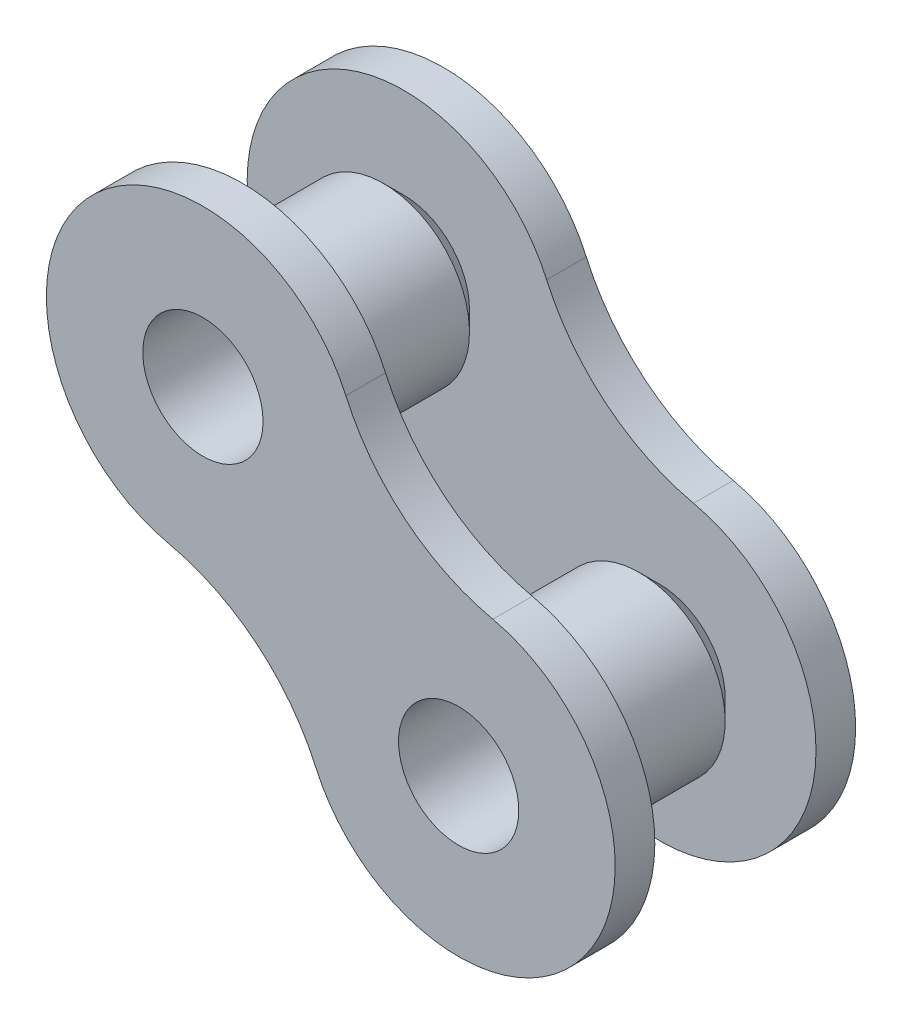
ISO-10303-21;
HEADER;
FILE_DESCRIPTION(('STEP AP214'),'2;1');
FILE_NAME('part.step','',(''),(''),'','','');
FILE_SCHEMA(('AUTOMOTIVE_DESIGN { 1 0 10303 214 1 1 1 1 }'));
ENDSEC;
DATA;
#1=APPLICATION_CONTEXT('core data for automotive mechanical design processes');
#2=APPLICATION_PROTOCOL_DEFINITION('international standard','automotive_design',2000,#1);
#3=PRODUCT_CONTEXT('',#1,'mechanical');
#4=PRODUCT('Part','Part','',(#3));
#5=PRODUCT_RELATED_PRODUCT_CATEGORY('part','',(#4));
#6=PRODUCT_DEFINITION_FORMATION('','',#4);
#7=PRODUCT_DEFINITION_CONTEXT('part definition',#1,'design');
#8=PRODUCT_DEFINITION('design','',#6,#7);
#9=PRODUCT_DEFINITION_SHAPE('','',#8);
#10=(LENGTH_UNIT() NAMED_UNIT(*) SI_UNIT(.MILLI.,.METRE.));
#11=(NAMED_UNIT(*) PLANE_ANGLE_UNIT() SI_UNIT($,.RADIAN.));
#12=(NAMED_UNIT(*) SI_UNIT($,.STERADIAN.) SOLID_ANGLE_UNIT());
#13=UNCERTAINTY_MEASURE_WITH_UNIT(LENGTH_MEASURE(1.E-05),#10,'distance_accuracy_value','');
#14=(GEOMETRIC_REPRESENTATION_CONTEXT(3) GLOBAL_UNCERTAINTY_ASSIGNED_CONTEXT((#13)) GLOBAL_UNIT_ASSIGNED_CONTEXT((#10,
#11,#12)) REPRESENTATION_CONTEXT('',''));
#15=CARTESIAN_POINT('',(0.,0.,0.));
#16=DIRECTION('',(0.,0.,1.));
#17=DIRECTION('',(1.,0.,0.));
#18=AXIS2_PLACEMENT_3D('',#15,#16,#17);
#19=CARTESIAN_POINT('',(92.1534993472489,85.157790056429,-128.5494));
#20=DIRECTION('',(0.,0.,-1.));
#21=DIRECTION('',(0.,-1.,0.));
#22=AXIS2_PLACEMENT_3D('',#19,#20,#21);
#23=PLANE('',#22);
#24=CARTESIAN_POINT('',(94.6116819283963,83.1483216198161,-128.5494));
#25=DIRECTION('',(0.,0.,1.));
#26=DIRECTION('',(-0.774230734219652,0.632903444602491,0.));
#27=AXIS2_PLACEMENT_3D('',#24,#25,#26);
#28=CIRCLE('',#27,3.0099);
#29=CARTESIAN_POINT('',(91.8634808963714,81.9207675079427,-128.5494));
#30=VERTEX_POINT('',#29);
#31=CARTESIAN_POINT('',(95.2681925979815,86.0857510659,-128.5494));
#32=VERTEX_POINT('',#31);
#33=EDGE_CURVE('E178',#30,#32,#28,.T.);
#34=ORIENTED_EDGE('',*,*,#33,.T.);
#35=CARTESIAN_POINT('',(96.1547622248793,90.052534621296,-128.5494));
#36=DIRECTION('',(0.,0.,1.));
#37=DIRECTION('',(-0.774230734219652,0.632903444602491,0.));
#38=AXIS2_PLACEMENT_3D('',#35,#36,#37);
#39=CIRCLE('',#38,4.06464973628698);
#40=CARTESIAN_POINT('',(92.4435177981264,88.3948126049153,-128.5494));
#41=VERTEX_POINT('',#40);
#42=EDGE_CURVE('E160',#41,#32,#39,.T.);
#43=ORIENTED_EDGE('',*,*,#42,.F.);
#44=CARTESIAN_POINT('',(89.6953167661015,87.1672584930419,-128.5494));
#45=DIRECTION('',(0.,0.,1.));
#46=DIRECTION('',(-0.774230734219652,0.632903444602491,0.));
#47=AXIS2_PLACEMENT_3D('',#44,#45,#46);
#48=CIRCLE('',#47,3.0099);
#49=CARTESIAN_POINT('',(89.0388060965162,84.229829046958,-128.5494));
#50=VERTEX_POINT('',#49);
#51=EDGE_CURVE('E187',#41,#50,#48,.T.);
#52=ORIENTED_EDGE('',*,*,#51,.T.);
#53=CARTESIAN_POINT('',(88.1522364696185,80.2630454915621,-128.5494));
#54=DIRECTION('',(0.,0.,1.));
#55=DIRECTION('',(-0.774230734219652,0.632903444602491,0.));
#56=AXIS2_PLACEMENT_3D('',#53,#54,#55);
#57=CIRCLE('',#56,4.06464973628691);
#58=EDGE_CURVE('E25',#30,#50,#57,.T.);
#59=ORIENTED_EDGE('',*,*,#58,.F.);
#60=EDGE_LOOP('',(#34,#43,#52,#59));
#61=FACE_BOUND('',#60,.T.);
#62=CARTESIAN_POINT('',(89.6953167661015,87.1672584930419,-128.5494));
#63=DIRECTION('',(0.,0.,1.));
#64=DIRECTION('',(-0.774230734219652,0.632903444602491,0.));
#65=AXIS2_PLACEMENT_3D('',#62,#63,#64);
#66=CIRCLE('',#65,1.26365);
#67=CARTESIAN_POINT('',(88.7169600988048,87.9670269308138,-128.5494));
#68=VERTEX_POINT('',#67);
#69=EDGE_CURVE('E276',#68,#68,#66,.T.);
#70=ORIENTED_EDGE('',*,*,#69,.F.);
#71=EDGE_LOOP('',(#70));
#72=FACE_BOUND('',#71,.T.);
#73=CARTESIAN_POINT('',(94.6116819283963,83.1483216198161,-128.5494));
#74=DIRECTION('',(0.,0.,1.));
#75=DIRECTION('',(-0.774230734219652,0.632903444602491,0.));
#76=AXIS2_PLACEMENT_3D('',#73,#74,#75);
#77=CIRCLE('',#76,1.26365);
#78=CARTESIAN_POINT('',(93.6333252610996,83.948090057588,-128.5494));
#79=VERTEX_POINT('',#78);
#80=EDGE_CURVE('E274',#79,#79,#77,.T.);
#81=ORIENTED_EDGE('',*,*,#80,.F.);
#82=EDGE_LOOP('',(#81));
#83=FACE_BOUND('',#82,.T.);
#84=ADVANCED_FACE('F17',(#61,#72,#83),#23,.F.);
#85=CARTESIAN_POINT('',(92.1534993472489,85.157790056429,-129.3114));
#86=DIRECTION('',(0.,0.,-1.));
#87=DIRECTION('',(0.,-1.,0.));
#88=AXIS2_PLACEMENT_3D('',#85,#86,#87);
#89=PLANE('',#88);
#90=CARTESIAN_POINT('',(94.6116819283963,83.1483216198161,-129.3114));
#91=DIRECTION('',(0.,0.,1.));
#92=DIRECTION('',(-0.774230734219652,0.632903444602491,0.));
#93=AXIS2_PLACEMENT_3D('',#90,#91,#92);
#94=CIRCLE('',#93,1.1557);
#95=CARTESIAN_POINT('',(93.7169034688586,83.8797681307432,-129.3114));
#96=VERTEX_POINT('',#95);
#97=EDGE_CURVE('E208',#96,#96,#94,.T.);
#98=ORIENTED_EDGE('',*,*,#97,.T.);
#99=EDGE_LOOP('',(#98));
#100=FACE_BOUND('',#99,.T.);
#101=CARTESIAN_POINT('',(89.6953167661015,87.1672584930419,-129.3114));
#102=DIRECTION('',(0.,0.,1.));
#103=DIRECTION('',(-0.774230734219652,0.632903444602491,0.));
#104=AXIS2_PLACEMENT_3D('',#101,#102,#103);
#105=CIRCLE('',#104,1.1557);
#106=CARTESIAN_POINT('',(88.8005383065638,87.898705003969,-129.3114));
#107=VERTEX_POINT('',#106);
#108=EDGE_CURVE('E201',#107,#107,#105,.T.);
#109=ORIENTED_EDGE('',*,*,#108,.T.);
#110=EDGE_LOOP('',(#109));
#111=FACE_BOUND('',#110,.T.);
#112=CARTESIAN_POINT('',(94.6116819283963,83.1483216198161,-129.3114));
#113=DIRECTION('',(0.,0.,1.));
#114=DIRECTION('',(-0.774230734219652,0.632903444602491,0.));
#115=AXIS2_PLACEMENT_3D('',#112,#113,#114);
#116=CIRCLE('',#115,3.0099);
#117=CARTESIAN_POINT('',(91.8634808963714,81.9207675079427,-129.3114));
#118=VERTEX_POINT('',#117);
#119=CARTESIAN_POINT('',(95.2681925979815,86.0857510659,-129.3114));
#120=VERTEX_POINT('',#119);
#121=EDGE_CURVE('E151',#118,#120,#116,.T.);
#122=ORIENTED_EDGE('',*,*,#121,.F.);
#123=CARTESIAN_POINT('',(88.1522364696185,80.2630454915621,-129.3114));
#124=DIRECTION('',(0.,0.,1.));
#125=DIRECTION('',(-0.774230734219652,0.632903444602491,0.));
#126=AXIS2_PLACEMENT_3D('',#123,#124,#125);
#127=CIRCLE('',#126,4.06464973628691);
#128=CARTESIAN_POINT('',(89.0388060965162,84.229829046958,-129.3114));
#129=VERTEX_POINT('',#128);
#130=EDGE_CURVE('E11',#118,#129,#127,.T.);
#131=ORIENTED_EDGE('',*,*,#130,.T.);
#132=CARTESIAN_POINT('',(89.6953167661015,87.1672584930419,-129.3114));
#133=DIRECTION('',(0.,0.,1.));
#134=DIRECTION('',(-0.774230734219652,0.632903444602491,0.));
#135=AXIS2_PLACEMENT_3D('',#132,#133,#134);
#136=CIRCLE('',#135,3.0099);
#137=CARTESIAN_POINT('',(92.4435177981264,88.3948126049153,-129.3114));
#138=VERTEX_POINT('',#137);
#139=EDGE_CURVE('E154',#138,#129,#136,.T.);
#140=ORIENTED_EDGE('',*,*,#139,.F.);
#141=CARTESIAN_POINT('',(96.1547622248793,90.052534621296,-129.3114));
#142=DIRECTION('',(0.,0.,1.));
#143=DIRECTION('',(-0.774230734219652,0.632903444602491,0.));
#144=AXIS2_PLACEMENT_3D('',#141,#142,#143);
#145=CIRCLE('',#144,4.06464973628698);
#146=EDGE_CURVE('E147',#138,#120,#145,.T.);
#147=ORIENTED_EDGE('',*,*,#146,.T.);
#148=EDGE_LOOP('',(#122,#131,#140,#147));
#149=FACE_BOUND('',#148,.T.);
#150=ADVANCED_FACE('F149',(#100,#111,#149),#89,.T.);
#151=CARTESIAN_POINT('',(88.1522364696185,80.2630454915621,-129.3114));
#152=DIRECTION('',(0.,0.,1.));
#153=DIRECTION('',(0.774230734219652,-0.632903444602491,0.));
#154=AXIS2_PLACEMENT_3D('',#151,#152,#153);
#155=CYLINDRICAL_SURFACE('',#154,4.06464973628691);
#156=ORIENTED_EDGE('',*,*,#58,.T.);
#157=DIRECTION('',(0.,0.,1.));
#158=VECTOR('',#157,1.);
#159=CARTESIAN_POINT('',(89.0388060965162,84.229829046958,-129.3114));
#160=LINE('',#159,#158);
#161=EDGE_CURVE('E191',#129,#50,#160,.T.);
#162=ORIENTED_EDGE('',*,*,#161,.F.);
#163=ORIENTED_EDGE('',*,*,#130,.F.);
#164=DIRECTION('',(0.,0.,1.));
#165=VECTOR('',#164,1.);
#166=CARTESIAN_POINT('',(91.8634808963714,81.9207675079427,-129.3114));
#167=LINE('',#166,#165);
#168=EDGE_CURVE('E172',#118,#30,#167,.T.);
#169=ORIENTED_EDGE('',*,*,#168,.T.);
#170=EDGE_LOOP('',(#156,#162,#163,#169));
#171=FACE_BOUND('',#170,.T.);
#172=ADVANCED_FACE('F284',(#171),#155,.F.);
#173=CARTESIAN_POINT('',(89.6953167661015,87.1672584930419,-129.3114));
#174=DIRECTION('',(0.,0.,1.));
#175=DIRECTION('',(0.774230734219652,-0.632903444602491,0.));
#176=AXIS2_PLACEMENT_3D('',#173,#174,#175);
#177=CYLINDRICAL_SURFACE('',#176,3.0099);
#178=ORIENTED_EDGE('',*,*,#51,.F.);
#179=DIRECTION('',(0.,0.,1.));
#180=VECTOR('',#179,1.);
#181=CARTESIAN_POINT('',(92.4435177981264,88.3948126049153,-129.3114));
#182=LINE('',#181,#180);
#183=EDGE_CURVE('E159',#138,#41,#182,.T.);
#184=ORIENTED_EDGE('',*,*,#183,.F.);
#185=ORIENTED_EDGE('',*,*,#139,.T.);
#186=ORIENTED_EDGE('',*,*,#161,.T.);
#187=EDGE_LOOP('',(#178,#184,#185,#186));
#188=FACE_BOUND('',#187,.T.);
#189=ADVANCED_FACE('F285',(#188),#177,.T.);
#190=CARTESIAN_POINT('',(96.1547622248793,90.052534621296,-129.3114));
#191=DIRECTION('',(0.,0.,1.));
#192=DIRECTION('',(0.774230734219652,-0.632903444602491,0.));
#193=AXIS2_PLACEMENT_3D('',#190,#191,#192);
#194=CYLINDRICAL_SURFACE('',#193,4.06464973628698);
#195=ORIENTED_EDGE('',*,*,#42,.T.);
#196=DIRECTION('',(0.,0.,1.));
#197=VECTOR('',#196,1.);
#198=CARTESIAN_POINT('',(95.2681925979815,86.0857510659,-129.3114));
#199=LINE('',#198,#197);
#200=EDGE_CURVE('E163',#120,#32,#199,.T.);
#201=ORIENTED_EDGE('',*,*,#200,.F.);
#202=ORIENTED_EDGE('',*,*,#146,.F.);
#203=ORIENTED_EDGE('',*,*,#183,.T.);
#204=EDGE_LOOP('',(#195,#201,#202,#203));
#205=FACE_BOUND('',#204,.T.);
#206=ADVANCED_FACE('F164',(#205),#194,.F.);
#207=CARTESIAN_POINT('',(94.6116819283963,83.1483216198161,-129.3114));
#208=DIRECTION('',(0.,0.,1.));
#209=DIRECTION('',(0.774230734219652,-0.632903444602491,0.));
#210=AXIS2_PLACEMENT_3D('',#207,#208,#209);
#211=CYLINDRICAL_SURFACE('',#210,3.0099);
#212=ORIENTED_EDGE('',*,*,#33,.F.);
#213=ORIENTED_EDGE('',*,*,#168,.F.);
#214=ORIENTED_EDGE('',*,*,#121,.T.);
#215=ORIENTED_EDGE('',*,*,#200,.T.);
#216=EDGE_LOOP('',(#212,#213,#214,#215));
#217=FACE_BOUND('',#216,.T.);
#218=ADVANCED_FACE('F171',(#217),#211,.T.);
#219=CARTESIAN_POINT('',(89.6953167661015,87.1672584930419,-128.5494));
#220=DIRECTION('',(0.,0.,1.));
#221=DIRECTION('',(0.774230734219652,-0.632903444602491,0.));
#222=AXIS2_PLACEMENT_3D('',#219,#220,#221);
#223=CONICAL_SURFACE('',#222,1.26365,0.785398163397448);
#224=ORIENTED_EDGE('',*,*,#69,.T.);
#225=EDGE_LOOP('',(#224));
#226=FACE_BOUND('',#225,.T.);
#227=CARTESIAN_POINT('',(89.6953167661015,87.1672584930419,-128.16205));
#228=DIRECTION('',(0.,0.,-1.));
#229=DIRECTION('',(-0.774230734219652,0.632903444602491,0.));
#230=AXIS2_PLACEMENT_3D('',#227,#228,#229);
#231=CIRCLE('',#230,1.651);
#232=CARTESIAN_POINT('',(88.4170618239049,88.2121820800806,-128.16205));
#233=VERTEX_POINT('',#232);
#234=EDGE_CURVE('E209',#233,#233,#231,.T.);
#235=ORIENTED_EDGE('',*,*,#234,.T.);
#236=EDGE_LOOP('',(#235));
#237=FACE_BOUND('',#236,.T.);
#238=ADVANCED_FACE('F367',(#226,#237),#223,.T.);
#239=CARTESIAN_POINT('',(94.6116819283963,83.1483216198161,-128.5494));
#240=DIRECTION('',(0.,0.,1.));
#241=DIRECTION('',(0.774230734219652,-0.632903444602491,0.));
#242=AXIS2_PLACEMENT_3D('',#239,#240,#241);
#243=CONICAL_SURFACE('',#242,1.26365,0.785398163397448);
#244=ORIENTED_EDGE('',*,*,#80,.T.);
#245=EDGE_LOOP('',(#244));
#246=FACE_BOUND('',#245,.T.);
#247=CARTESIAN_POINT('',(94.6116819283963,83.1483216198161,-128.16205));
#248=DIRECTION('',(0.,0.,-1.));
#249=DIRECTION('',(-0.774230734219652,0.632903444602491,0.));
#250=AXIS2_PLACEMENT_3D('',#247,#248,#249);
#251=CIRCLE('',#250,1.651);
#252=CARTESIAN_POINT('',(93.3334269861996,84.1932452068548,-128.16205));
#253=VERTEX_POINT('',#252);
#254=EDGE_CURVE('E224',#253,#253,#251,.T.);
#255=ORIENTED_EDGE('',*,*,#254,.T.);
#256=EDGE_LOOP('',(#255));
#257=FACE_BOUND('',#256,.T.);
#258=ADVANCED_FACE('F340',(#246,#257),#243,.T.);
#259=CARTESIAN_POINT('',(92.1534993472489,85.157790056429,-125.4506));
#260=DIRECTION('',(0.,0.,1.));
#261=DIRECTION('',(1.,0.,0.));
#262=AXIS2_PLACEMENT_3D('',#259,#260,#261);
#263=PLANE('',#262);
#264=CARTESIAN_POINT('',(94.6116819283963,83.1483216198161,-125.4506));
#265=DIRECTION('',(0.,0.,1.));
#266=DIRECTION('',(-0.774230734219652,0.632903444602491,0.));
#267=AXIS2_PLACEMENT_3D('',#264,#265,#266);
#268=CIRCLE('',#267,3.0099);
#269=CARTESIAN_POINT('',(91.8634808963714,81.9207675079427,-125.4506));
#270=VERTEX_POINT('',#269);
#271=CARTESIAN_POINT('',(95.2681925979815,86.0857510659,-125.4506));
#272=VERTEX_POINT('',#271);
#273=EDGE_CURVE('E228',#270,#272,#268,.T.);
#274=ORIENTED_EDGE('',*,*,#273,.F.);
#275=CARTESIAN_POINT('',(88.1522364696185,80.2630454915621,-125.4506));
#276=DIRECTION('',(0.,0.,1.));
#277=DIRECTION('',(-0.774230734219652,0.632903444602491,0.));
#278=AXIS2_PLACEMENT_3D('',#275,#276,#277);
#279=CIRCLE('',#278,4.06464973628691);
#280=CARTESIAN_POINT('',(89.0388060965162,84.229829046958,-125.4506));
#281=VERTEX_POINT('',#280);
#282=EDGE_CURVE('E268',#270,#281,#279,.T.);
#283=ORIENTED_EDGE('',*,*,#282,.T.);
#284=CARTESIAN_POINT('',(89.6953167661015,87.1672584930419,-125.4506));
#285=DIRECTION('',(0.,0.,1.));
#286=DIRECTION('',(-0.774230734219652,0.632903444602491,0.));
#287=AXIS2_PLACEMENT_3D('',#284,#285,#286);
#288=CIRCLE('',#287,3.0099);
#289=CARTESIAN_POINT('',(92.4435177981264,88.3948126049153,-125.4506));
#290=VERTEX_POINT('',#289);
#291=EDGE_CURVE('E254',#290,#281,#288,.T.);
#292=ORIENTED_EDGE('',*,*,#291,.F.);
#293=CARTESIAN_POINT('',(96.1547622248793,90.052534621296,-125.4506));
#294=DIRECTION('',(0.,0.,1.));
#295=DIRECTION('',(-0.774230734219652,0.632903444602491,0.));
#296=AXIS2_PLACEMENT_3D('',#293,#294,#295);
#297=CIRCLE('',#296,4.06464973628698);
#298=EDGE_CURVE('E238',#290,#272,#297,.T.);
#299=ORIENTED_EDGE('',*,*,#298,.T.);
#300=EDGE_LOOP('',(#274,#283,#292,#299));
#301=FACE_BOUND('',#300,.T.);
#302=CARTESIAN_POINT('',(89.6953167661015,87.1672584930419,-125.4506));
#303=DIRECTION('',(0.,0.,1.));
#304=DIRECTION('',(-0.774230734219652,0.632903444602491,0.));
#305=AXIS2_PLACEMENT_3D('',#302,#303,#304);
#306=CIRCLE('',#305,1.26365);
#307=CARTESIAN_POINT('',(88.7169600988048,87.9670269308138,-125.4506));
#308=VERTEX_POINT('',#307);
#309=EDGE_CURVE('E212',#308,#308,#306,.T.);
#310=ORIENTED_EDGE('',*,*,#309,.T.);
#311=EDGE_LOOP('',(#310));
#312=FACE_BOUND('',#311,.T.);
#313=CARTESIAN_POINT('',(94.6116819283963,83.1483216198161,-125.4506));
#314=DIRECTION('',(0.,0.,1.));
#315=DIRECTION('',(-0.774230734219652,0.632903444602491,0.));
#316=AXIS2_PLACEMENT_3D('',#313,#314,#315);
#317=CIRCLE('',#316,1.26365);
#318=CARTESIAN_POINT('',(93.6333252610996,83.948090057588,-125.4506));
#319=VERTEX_POINT('',#318);
#320=EDGE_CURVE('E231',#319,#319,#317,.T.);
#321=ORIENTED_EDGE('',*,*,#320,.T.);
#322=EDGE_LOOP('',(#321));
#323=FACE_BOUND('',#322,.T.);
#324=ADVANCED_FACE('F319',(#301,#312,#323),#263,.F.);
#325=CARTESIAN_POINT('',(92.1534993472489,85.157790056429,-124.6886));
#326=DIRECTION('',(0.,0.,1.));
#327=DIRECTION('',(1.,0.,0.));
#328=AXIS2_PLACEMENT_3D('',#325,#326,#327);
#329=PLANE('',#328);
#330=CARTESIAN_POINT('',(94.6116819283963,83.1483216198161,-124.6886));
#331=DIRECTION('',(0.,0.,1.));
#332=DIRECTION('',(-0.774230734219652,0.632903444602491,0.));
#333=AXIS2_PLACEMENT_3D('',#330,#331,#332);
#334=CIRCLE('',#333,1.1557);
#335=CARTESIAN_POINT('',(93.7169034688586,83.8797681307432,-124.6886));
#336=VERTEX_POINT('',#335);
#337=EDGE_CURVE('E205',#336,#336,#334,.T.);
#338=ORIENTED_EDGE('',*,*,#337,.F.);
#339=EDGE_LOOP('',(#338));
#340=FACE_BOUND('',#339,.T.);
#341=CARTESIAN_POINT('',(89.6953167661015,87.1672584930419,-124.6886));
#342=DIRECTION('',(0.,0.,1.));
#343=DIRECTION('',(-0.774230734219652,0.632903444602491,0.));
#344=AXIS2_PLACEMENT_3D('',#341,#342,#343);
#345=CIRCLE('',#344,1.1557);
#346=CARTESIAN_POINT('',(88.8005383065638,87.898705003969,-124.6886));
#347=VERTEX_POINT('',#346);
#348=EDGE_CURVE('E203',#347,#347,#345,.T.);
#349=ORIENTED_EDGE('',*,*,#348,.F.);
#350=EDGE_LOOP('',(#349));
#351=FACE_BOUND('',#350,.T.);
#352=CARTESIAN_POINT('',(94.6116819283963,83.1483216198161,-124.6886));
#353=DIRECTION('',(0.,0.,1.));
#354=DIRECTION('',(-0.774230734219652,0.632903444602491,0.));
#355=AXIS2_PLACEMENT_3D('',#352,#353,#354);
#356=CIRCLE('',#355,3.0099);
#357=CARTESIAN_POINT('',(91.8634808963714,81.9207675079427,-124.6886));
#358=VERTEX_POINT('',#357);
#359=CARTESIAN_POINT('',(95.2681925979815,86.0857510659,-124.6886));
#360=VERTEX_POINT('',#359);
#361=EDGE_CURVE('E216',#358,#360,#356,.T.);
#362=ORIENTED_EDGE('',*,*,#361,.T.);
#363=CARTESIAN_POINT('',(96.1547622248793,90.052534621296,-124.6886));
#364=DIRECTION('',(0.,0.,1.));
#365=DIRECTION('',(-0.774230734219652,0.632903444602491,0.));
#366=AXIS2_PLACEMENT_3D('',#363,#364,#365);
#367=CIRCLE('',#366,4.06464973628698);
#368=CARTESIAN_POINT('',(92.4435177981264,88.3948126049153,-124.6886));
#369=VERTEX_POINT('',#368);
#370=EDGE_CURVE('E237',#369,#360,#367,.T.);
#371=ORIENTED_EDGE('',*,*,#370,.F.);
#372=CARTESIAN_POINT('',(89.6953167661015,87.1672584930419,-124.6886));
#373=DIRECTION('',(0.,0.,1.));
#374=DIRECTION('',(-0.774230734219652,0.632903444602491,0.));
#375=AXIS2_PLACEMENT_3D('',#372,#373,#374);
#376=CIRCLE('',#375,3.0099);
#377=CARTESIAN_POINT('',(89.0388060965162,84.229829046958,-124.6886));
#378=VERTEX_POINT('',#377);
#379=EDGE_CURVE('E264',#369,#378,#376,.T.);
#380=ORIENTED_EDGE('',*,*,#379,.T.);
#381=CARTESIAN_POINT('',(88.1522364696185,80.2630454915621,-124.6886));
#382=DIRECTION('',(0.,0.,1.));
#383=DIRECTION('',(-0.774230734219652,0.632903444602491,0.));
#384=AXIS2_PLACEMENT_3D('',#381,#382,#383);
#385=CIRCLE('',#384,4.06464973628691);
#386=EDGE_CURVE('E270',#358,#378,#385,.T.);
#387=ORIENTED_EDGE('',*,*,#386,.F.);
#388=EDGE_LOOP('',(#362,#371,#380,#387));
#389=FACE_BOUND('',#388,.T.);
#390=ADVANCED_FACE('F315',(#340,#351,#389),#329,.T.);
#391=CARTESIAN_POINT('',(88.1522364696185,80.2630454915621,-124.6886));
#392=DIRECTION('',(0.,0.,-1.));
#393=DIRECTION('',(0.774230734219652,-0.632903444602491,0.));
#394=AXIS2_PLACEMENT_3D('',#391,#392,#393);
#395=CYLINDRICAL_SURFACE('',#394,4.06464973628691);
#396=ORIENTED_EDGE('',*,*,#282,.F.);
#397=DIRECTION('',(0.,0.,-1.));
#398=VECTOR('',#397,1.);
#399=CARTESIAN_POINT('',(91.8634808963714,81.9207675079427,-124.6886));
#400=LINE('',#399,#398);
#401=EDGE_CURVE('E220',#358,#270,#400,.T.);
#402=ORIENTED_EDGE('',*,*,#401,.F.);
#403=ORIENTED_EDGE('',*,*,#386,.T.);
#404=DIRECTION('',(0.,0.,-1.));
#405=VECTOR('',#404,1.);
#406=CARTESIAN_POINT('',(89.0388060965162,84.229829046958,-124.6886));
#407=LINE('',#406,#405);
#408=EDGE_CURVE('E258',#378,#281,#407,.T.);
#409=ORIENTED_EDGE('',*,*,#408,.T.);
#410=EDGE_LOOP('',(#396,#402,#403,#409));
#411=FACE_BOUND('',#410,.T.);
#412=ADVANCED_FACE('F318',(#411),#395,.F.);
#413=CARTESIAN_POINT('',(89.6953167661015,87.1672584930419,-124.6886));
#414=DIRECTION('',(0.,0.,-1.));
#415=DIRECTION('',(0.774230734219652,-0.632903444602491,0.));
#416=AXIS2_PLACEMENT_3D('',#413,#414,#415);
#417=CYLINDRICAL_SURFACE('',#416,3.0099);
#418=ORIENTED_EDGE('',*,*,#291,.T.);
#419=ORIENTED_EDGE('',*,*,#408,.F.);
#420=ORIENTED_EDGE('',*,*,#379,.F.);
#421=DIRECTION('',(0.,0.,-1.));
#422=VECTOR('',#421,1.);
#423=CARTESIAN_POINT('',(92.4435177981264,88.3948126049153,-124.6886));
#424=LINE('',#423,#422);
#425=EDGE_CURVE('E234',#369,#290,#424,.T.);
#426=ORIENTED_EDGE('',*,*,#425,.T.);
#427=EDGE_LOOP('',(#418,#419,#420,#426));
#428=FACE_BOUND('',#427,.T.);
#429=ADVANCED_FACE('F334',(#428),#417,.T.);
#430=CARTESIAN_POINT('',(96.1547622248793,90.052534621296,-124.6886));
#431=DIRECTION('',(0.,0.,-1.));
#432=DIRECTION('',(0.774230734219652,-0.632903444602491,0.));
#433=AXIS2_PLACEMENT_3D('',#430,#431,#432);
#434=CYLINDRICAL_SURFACE('',#433,4.06464973628698);
#435=ORIENTED_EDGE('',*,*,#298,.F.);
#436=ORIENTED_EDGE('',*,*,#425,.F.);
#437=ORIENTED_EDGE('',*,*,#370,.T.);
#438=DIRECTION('',(0.,0.,-1.));
#439=VECTOR('',#438,1.);
#440=CARTESIAN_POINT('',(95.2681925979815,86.0857510659,-124.6886));
#441=LINE('',#440,#439);
#442=EDGE_CURVE('E221',#360,#272,#441,.T.);
#443=ORIENTED_EDGE('',*,*,#442,.T.);
#444=EDGE_LOOP('',(#435,#436,#437,#443));
#445=FACE_BOUND('',#444,.T.);
#446=ADVANCED_FACE('F332',(#445),#434,.F.);
#447=CARTESIAN_POINT('',(94.6116819283963,83.1483216198161,-124.6886));
#448=DIRECTION('',(0.,0.,-1.));
#449=DIRECTION('',(0.774230734219652,-0.632903444602491,0.));
#450=AXIS2_PLACEMENT_3D('',#447,#448,#449);
#451=CYLINDRICAL_SURFACE('',#450,3.0099);
#452=ORIENTED_EDGE('',*,*,#273,.T.);
#453=ORIENTED_EDGE('',*,*,#442,.F.);
#454=ORIENTED_EDGE('',*,*,#361,.F.);
#455=ORIENTED_EDGE('',*,*,#401,.T.);
#456=EDGE_LOOP('',(#452,#453,#454,#455));
#457=FACE_BOUND('',#456,.T.);
#458=ADVANCED_FACE('F328',(#457),#451,.T.);
#459=CARTESIAN_POINT('',(89.6953167661015,87.1672584930419,-125.4506));
#460=DIRECTION('',(0.,0.,-1.));
#461=DIRECTION('',(0.774230734219652,-0.632903444602491,0.));
#462=AXIS2_PLACEMENT_3D('',#459,#460,#461);
#463=CONICAL_SURFACE('',#462,1.26365,0.785398163397448);
#464=ORIENTED_EDGE('',*,*,#309,.F.);
#465=EDGE_LOOP('',(#464));
#466=FACE_BOUND('',#465,.T.);
#467=CARTESIAN_POINT('',(89.6953167661015,87.1672584930419,-125.83795));
#468=DIRECTION('',(0.,0.,-1.));
#469=DIRECTION('',(-0.774230734219652,0.632903444602491,0.));
#470=AXIS2_PLACEMENT_3D('',#467,#468,#469);
#471=CIRCLE('',#470,1.651);
#472=CARTESIAN_POINT('',(88.4170618239049,88.2121820800806,-125.83795));
#473=VERTEX_POINT('',#472);
#474=EDGE_CURVE('E202',#473,#473,#471,.T.);
#475=ORIENTED_EDGE('',*,*,#474,.F.);
#476=EDGE_LOOP('',(#475));
#477=FACE_BOUND('',#476,.T.);
#478=ADVANCED_FACE('F371',(#466,#477),#463,.T.);
#479=CARTESIAN_POINT('',(89.6953167661015,87.1672584930419,-125.4506));
#480=DIRECTION('',(0.,0.,-1.));
#481=DIRECTION('',(0.774230734219652,-0.632903444602491,0.));
#482=AXIS2_PLACEMENT_3D('',#479,#480,#481);
#483=CYLINDRICAL_SURFACE('',#482,1.651);
#484=ORIENTED_EDGE('',*,*,#234,.F.);
#485=EDGE_LOOP('',(#484));
#486=FACE_BOUND('',#485,.T.);
#487=ORIENTED_EDGE('',*,*,#474,.T.);
#488=EDGE_LOOP('',(#487));
#489=FACE_BOUND('',#488,.T.);
#490=ADVANCED_FACE('F311',(#486,#489),#483,.T.);
#491=CARTESIAN_POINT('',(89.6953167661015,87.1672584930419,-125.4506));
#492=DIRECTION('',(0.,0.,-1.));
#493=DIRECTION('',(0.774230734219652,-0.632903444602491,0.));
#494=AXIS2_PLACEMENT_3D('',#491,#492,#493);
#495=CYLINDRICAL_SURFACE('',#494,1.1557);
#496=ORIENTED_EDGE('',*,*,#108,.F.);
#497=EDGE_LOOP('',(#496));
#498=FACE_BOUND('',#497,.T.);
#499=ORIENTED_EDGE('',*,*,#348,.T.);
#500=EDGE_LOOP('',(#499));
#501=FACE_BOUND('',#500,.T.);
#502=ADVANCED_FACE('F307',(#498,#501),#495,.F.);
#503=CARTESIAN_POINT('',(94.6116819283963,83.1483216198161,-125.4506));
#504=DIRECTION('',(0.,0.,-1.));
#505=DIRECTION('',(0.774230734219652,-0.632903444602491,0.));
#506=AXIS2_PLACEMENT_3D('',#503,#504,#505);
#507=CONICAL_SURFACE('',#506,1.26365,0.785398163397448);
#508=ORIENTED_EDGE('',*,*,#320,.F.);
#509=EDGE_LOOP('',(#508));
#510=FACE_BOUND('',#509,.T.);
#511=CARTESIAN_POINT('',(94.6116819283963,83.1483216198161,-125.83795));
#512=DIRECTION('',(0.,0.,-1.));
#513=DIRECTION('',(-0.774230734219652,0.632903444602491,0.));
#514=AXIS2_PLACEMENT_3D('',#511,#512,#513);
#515=CIRCLE('',#514,1.651);
#516=CARTESIAN_POINT('',(93.3334269861996,84.1932452068548,-125.83795));
#517=VERTEX_POINT('',#516);
#518=EDGE_CURVE('E215',#517,#517,#515,.T.);
#519=ORIENTED_EDGE('',*,*,#518,.F.);
#520=EDGE_LOOP('',(#519));
#521=FACE_BOUND('',#520,.T.);
#522=ADVANCED_FACE('F310',(#510,#521),#507,.T.);
#523=CARTESIAN_POINT('',(94.6116819283963,83.1483216198161,-125.4506));
#524=DIRECTION('',(0.,0.,-1.));
#525=DIRECTION('',(0.774230734219652,-0.632903444602491,0.));
#526=AXIS2_PLACEMENT_3D('',#523,#524,#525);
#527=CYLINDRICAL_SURFACE('',#526,1.651);
#528=ORIENTED_EDGE('',*,*,#254,.F.);
#529=EDGE_LOOP('',(#528));
#530=FACE_BOUND('',#529,.T.);
#531=ORIENTED_EDGE('',*,*,#518,.T.);
#532=EDGE_LOOP('',(#531));
#533=FACE_BOUND('',#532,.T.);
#534=ADVANCED_FACE('F348',(#530,#533),#527,.T.);
#535=CARTESIAN_POINT('',(94.6116819283963,83.1483216198161,-125.4506));
#536=DIRECTION('',(0.,0.,-1.));
#537=DIRECTION('',(0.774230734219652,-0.632903444602491,0.));
#538=AXIS2_PLACEMENT_3D('',#535,#536,#537);
#539=CYLINDRICAL_SURFACE('',#538,1.1557);
#540=ORIENTED_EDGE('',*,*,#97,.F.);
#541=EDGE_LOOP('',(#540));
#542=FACE_BOUND('',#541,.T.);
#543=ORIENTED_EDGE('',*,*,#337,.T.);
#544=EDGE_LOOP('',(#543));
#545=FACE_BOUND('',#544,.T.);
#546=ADVANCED_FACE('F353',(#542,#545),#539,.F.);
#547=CLOSED_SHELL('',(#84,#150,#172,#189,#206,#218,#238,#258,#324,#390,#412,#429,#446,#458,#478,
#490,#502,#522,#534,#546));
#548=MANIFOLD_SOLID_BREP('B1',#547);
#549=ADVANCED_BREP_SHAPE_REPRESENTATION('',(#18,#548),#14);
#550=SHAPE_DEFINITION_REPRESENTATION(#9,#549);
ENDSEC;
END-ISO-10303-21;
